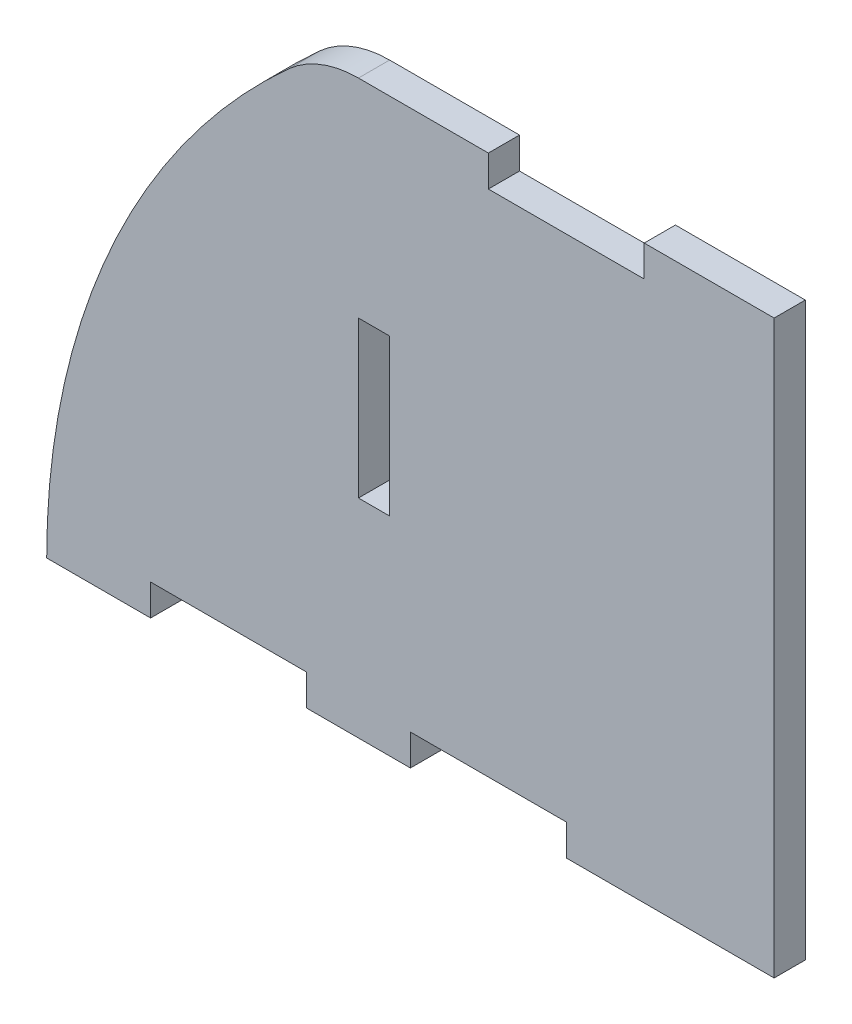
ISO-10303-21;
HEADER;
FILE_DESCRIPTION(('STEP AP214'),'2;1');
FILE_NAME('part.step','',(''),(''),'','','');
FILE_SCHEMA(('AUTOMOTIVE_DESIGN { 1 0 10303 214 1 1 1 1 }'));
ENDSEC;
DATA;
#1=APPLICATION_CONTEXT('core data for automotive mechanical design processes');
#2=APPLICATION_PROTOCOL_DEFINITION('international standard','automotive_design',2000,#1);
#3=PRODUCT_CONTEXT('',#1,'mechanical');
#4=PRODUCT('Part','Part','',(#3));
#5=PRODUCT_RELATED_PRODUCT_CATEGORY('part','',(#4));
#6=PRODUCT_DEFINITION_FORMATION('','',#4);
#7=PRODUCT_DEFINITION_CONTEXT('part definition',#1,'design');
#8=PRODUCT_DEFINITION('design','',#6,#7);
#9=PRODUCT_DEFINITION_SHAPE('','',#8);
#10=(LENGTH_UNIT() NAMED_UNIT(*) SI_UNIT(.MILLI.,.METRE.));
#11=(NAMED_UNIT(*) PLANE_ANGLE_UNIT() SI_UNIT($,.RADIAN.));
#12=(NAMED_UNIT(*) SI_UNIT($,.STERADIAN.) SOLID_ANGLE_UNIT());
#13=UNCERTAINTY_MEASURE_WITH_UNIT(LENGTH_MEASURE(1.E-05),#10,'distance_accuracy_value','');
#14=(GEOMETRIC_REPRESENTATION_CONTEXT(3) GLOBAL_UNCERTAINTY_ASSIGNED_CONTEXT((#13)) GLOBAL_UNIT_ASSIGNED_CONTEXT((#10,
#11,#12)) REPRESENTATION_CONTEXT('',''));
#15=CARTESIAN_POINT('',(0.,0.,0.));
#16=DIRECTION('',(0.,0.,1.));
#17=DIRECTION('',(1.,0.,0.));
#18=AXIS2_PLACEMENT_3D('',#15,#16,#17);
#19=CARTESIAN_POINT('',(-70.0000000000001,0.,3.00000000000034));
#20=DIRECTION('',(0.,1.,0.));
#21=DIRECTION('',(0.,0.,1.00000000000001));
#22=AXIS2_PLACEMENT_3D('',#19,#20,#21);
#23=PLANE('',#22);
#24=DIRECTION('',(1.00000000000001,0.,0.));
#25=VECTOR('',#24,1.);
#26=CARTESIAN_POINT('',(-70.0000000000001,0.,3.33066907387547E-13));
#27=LINE('',#26,#25);
#28=CARTESIAN_POINT('',(-70.0000000000001,0.,3.33066907387547E-13));
#29=VERTEX_POINT('',#28);
#30=CARTESIAN_POINT('',(-60.0000000000001,0.,2.77555756156289E-13));
#31=VERTEX_POINT('',#30);
#32=EDGE_CURVE('E307',#29,#31,#27,.T.);
#33=ORIENTED_EDGE('',*,*,#32,.T.);
#34=DIRECTION('',(0.,0.,1.00000000000001));
#35=VECTOR('',#34,1.);
#36=CARTESIAN_POINT('',(-60.0000000000001,0.,2.77555756156289E-13));
#37=LINE('',#36,#35);
#38=CARTESIAN_POINT('',(-60.0000000000001,0.,3.00000000000028));
#39=VERTEX_POINT('',#38);
#40=EDGE_CURVE('E222',#31,#39,#37,.T.);
#41=ORIENTED_EDGE('',*,*,#40,.T.);
#42=DIRECTION('',(1.00000000000001,0.,0.));
#43=VECTOR('',#42,1.);
#44=CARTESIAN_POINT('',(-70.0000000000001,0.,3.00000000000034));
#45=LINE('',#44,#43);
#46=CARTESIAN_POINT('',(-70.0000000000001,0.,3.00000000000034));
#47=VERTEX_POINT('',#46);
#48=EDGE_CURVE('E291',#47,#39,#45,.T.);
#49=ORIENTED_EDGE('',*,*,#48,.F.);
#50=DIRECTION('',(0.,0.,-1.00000000000001));
#51=VECTOR('',#50,1.);
#52=CARTESIAN_POINT('',(-70.0000000000001,0.,3.00000000000034));
#53=LINE('',#52,#51);
#54=EDGE_CURVE('E306',#47,#29,#53,.T.);
#55=ORIENTED_EDGE('',*,*,#54,.T.);
#56=EDGE_LOOP('',(#33,#41,#49,#55));
#57=FACE_BOUND('',#56,.T.);
#58=ADVANCED_FACE('F32',(#57),#23,.F.);
#59=CARTESIAN_POINT('',(-44.9999999999999,0.,3.00000000000022));
#60=VERTEX_POINT('',#59);
#61=CARTESIAN_POINT('',(-34.9999999999999,0.,3.00000000000022));
#62=VERTEX_POINT('',#61);
#63=EDGE_CURVE('E295',#60,#62,#45,.T.);
#64=ORIENTED_EDGE('',*,*,#63,.F.);
#65=DIRECTION('',(0.,0.,1.00000000000001));
#66=VECTOR('',#65,1.);
#67=CARTESIAN_POINT('',(-44.9999999999999,0.,0.));
#68=LINE('',#67,#66);
#69=CARTESIAN_POINT('',(-44.9999999999999,0.,0.));
#70=VERTEX_POINT('',#69);
#71=EDGE_CURVE('E234',#70,#60,#68,.T.);
#72=ORIENTED_EDGE('',*,*,#71,.F.);
#73=CARTESIAN_POINT('',(-35.0000000000001,0.,0.));
#74=VERTEX_POINT('',#73);
#75=EDGE_CURVE('E311',#70,#74,#27,.T.);
#76=ORIENTED_EDGE('',*,*,#75,.T.);
#77=DIRECTION('',(0.,0.,1.00000000000001));
#78=VECTOR('',#77,1.);
#79=CARTESIAN_POINT('',(-35.0000000000001,0.,0.));
#80=LINE('',#79,#78);
#81=EDGE_CURVE('E248',#74,#62,#80,.T.);
#82=ORIENTED_EDGE('',*,*,#81,.T.);
#83=EDGE_LOOP('',(#64,#72,#76,#82));
#84=FACE_BOUND('',#83,.T.);
#85=ADVANCED_FACE('F361',(#84),#23,.F.);
#86=CARTESIAN_POINT('',(0.,55.,3.));
#87=DIRECTION('',(0.,-1.,0.));
#88=DIRECTION('',(0.,0.,-1.00000000000001));
#89=AXIS2_PLACEMENT_3D('',#86,#87,#88);
#90=PLANE('',#89);
#91=DIRECTION('',(-1.00000000000001,0.,0.));
#92=VECTOR('',#91,1.);
#93=CARTESIAN_POINT('',(0.,55.,3.));
#94=LINE('',#93,#92);
#95=CARTESIAN_POINT('',(-27.5000000000001,55.,3.00000000000028));
#96=VERTEX_POINT('',#95);
#97=CARTESIAN_POINT('',(-40.,55.,3.00000000000028));
#98=VERTEX_POINT('',#97);
#99=EDGE_CURVE('E298',#96,#98,#94,.T.);
#100=ORIENTED_EDGE('',*,*,#99,.F.);
#101=DIRECTION('',(0.,0.,1.00000000000001));
#102=VECTOR('',#101,1.);
#103=CARTESIAN_POINT('',(-27.5000000000001,55.,2.77555756156289E-13));
#104=LINE('',#103,#102);
#105=CARTESIAN_POINT('',(-27.5000000000001,55.,2.77555756156289E-13));
#106=VERTEX_POINT('',#105);
#107=EDGE_CURVE('E282',#106,#96,#104,.T.);
#108=ORIENTED_EDGE('',*,*,#107,.F.);
#109=DIRECTION('',(-1.00000000000001,0.,0.));
#110=VECTOR('',#109,1.);
#111=CARTESIAN_POINT('',(0.,55.,0.));
#112=LINE('',#111,#110);
#113=CARTESIAN_POINT('',(-40.,55.,2.77555756156289E-13));
#114=VERTEX_POINT('',#113);
#115=EDGE_CURVE('E313',#106,#114,#112,.T.);
#116=ORIENTED_EDGE('',*,*,#115,.T.);
#117=DIRECTION('',(0.,0.,-1.00000000000001));
#118=VECTOR('',#117,1.);
#119=CARTESIAN_POINT('',(-40.,55.,3.00000000000028));
#120=LINE('',#119,#118);
#121=EDGE_CURVE('E326',#98,#114,#120,.T.);
#122=ORIENTED_EDGE('',*,*,#121,.F.);
#123=EDGE_LOOP('',(#100,#108,#116,#122));
#124=FACE_BOUND('',#123,.T.);
#125=ADVANCED_FACE('F399',(#124),#90,.F.);
#126=CARTESIAN_POINT('',(-20.,0.,3.00000000000028));
#127=VERTEX_POINT('',#126);
#128=CARTESIAN_POINT('',(0.,0.,3.));
#129=VERTEX_POINT('',#128);
#130=EDGE_CURVE('E296',#127,#129,#45,.T.);
#131=ORIENTED_EDGE('',*,*,#130,.F.);
#132=DIRECTION('',(0.,0.,1.00000000000001));
#133=VECTOR('',#132,1.);
#134=CARTESIAN_POINT('',(-20.,0.,2.77555756156289E-13));
#135=LINE('',#134,#133);
#136=CARTESIAN_POINT('',(-20.,0.,2.77555756156289E-13));
#137=VERTEX_POINT('',#136);
#138=EDGE_CURVE('E261',#137,#127,#135,.T.);
#139=ORIENTED_EDGE('',*,*,#138,.F.);
#140=CARTESIAN_POINT('',(0.,0.,0.));
#141=VERTEX_POINT('',#140);
#142=EDGE_CURVE('E284',#137,#141,#27,.T.);
#143=ORIENTED_EDGE('',*,*,#142,.T.);
#144=DIRECTION('',(0.,0.,-1.00000000000001));
#145=VECTOR('',#144,1.);
#146=CARTESIAN_POINT('',(0.,0.,3.));
#147=LINE('',#146,#145);
#148=EDGE_CURVE('E11',#129,#141,#147,.T.);
#149=ORIENTED_EDGE('',*,*,#148,.F.);
#150=EDGE_LOOP('',(#131,#139,#143,#149));
#151=FACE_BOUND('',#150,.T.);
#152=ADVANCED_FACE('F34',(#151),#23,.F.);
#153=CARTESIAN_POINT('',(0.,0.,3.));
#154=DIRECTION('',(-1.00000000000001,0.,0.));
#155=DIRECTION('',(0.,0.,1.00000000000001));
#156=AXIS2_PLACEMENT_3D('',#153,#154,#155);
#157=PLANE('',#156);
#158=DIRECTION('',(0.,1.,0.));
#159=VECTOR('',#158,1.);
#160=CARTESIAN_POINT('',(0.,0.,0.));
#161=LINE('',#160,#159);
#162=CARTESIAN_POINT('',(0.,55.,0.));
#163=VERTEX_POINT('',#162);
#164=EDGE_CURVE('E310',#141,#163,#161,.T.);
#165=ORIENTED_EDGE('',*,*,#164,.T.);
#166=DIRECTION('',(0.,0.,-1.00000000000001));
#167=VECTOR('',#166,1.);
#168=CARTESIAN_POINT('',(0.,55.,3.));
#169=LINE('',#168,#167);
#170=CARTESIAN_POINT('',(0.,55.,3.));
#171=VERTEX_POINT('',#170);
#172=EDGE_CURVE('E40',#171,#163,#169,.T.);
#173=ORIENTED_EDGE('',*,*,#172,.F.);
#174=DIRECTION('',(0.,1.,0.));
#175=VECTOR('',#174,1.);
#176=CARTESIAN_POINT('',(0.,0.,3.));
#177=LINE('',#176,#175);
#178=EDGE_CURVE('E294',#129,#171,#177,.T.);
#179=ORIENTED_EDGE('',*,*,#178,.F.);
#180=ORIENTED_EDGE('',*,*,#148,.T.);
#181=EDGE_LOOP('',(#165,#173,#179,#180));
#182=FACE_BOUND('',#181,.T.);
#183=ADVANCED_FACE('F353',(#182),#157,.F.);
#184=CARTESIAN_POINT('',(-12.5,55.,0.));
#185=VERTEX_POINT('',#184);
#186=EDGE_CURVE('E314',#163,#185,#112,.T.);
#187=ORIENTED_EDGE('',*,*,#186,.T.);
#188=DIRECTION('',(0.,0.,1.00000000000001));
#189=VECTOR('',#188,1.);
#190=CARTESIAN_POINT('',(-12.5,55.,0.));
#191=LINE('',#190,#189);
#192=CARTESIAN_POINT('',(-12.5000000000002,55.,3.));
#193=VERTEX_POINT('',#192);
#194=EDGE_CURVE('E285',#185,#193,#191,.T.);
#195=ORIENTED_EDGE('',*,*,#194,.T.);
#196=EDGE_CURVE('E299',#171,#193,#94,.T.);
#197=ORIENTED_EDGE('',*,*,#196,.F.);
#198=ORIENTED_EDGE('',*,*,#172,.T.);
#199=EDGE_LOOP('',(#187,#195,#197,#198));
#200=FACE_BOUND('',#199,.T.);
#201=ADVANCED_FACE('F333',(#200),#90,.F.);
#202=CARTESIAN_POINT('',(-40.,45.,3.00000000000028));
#203=DIRECTION('',(0.,0.,-1.00000000000001));
#204=DIRECTION('',(-1.00000000000001,0.,0.));
#205=AXIS2_PLACEMENT_3D('',#202,#203,#204);
#206=CYLINDRICAL_SURFACE('',#205,9.99999999999994);
#207=CARTESIAN_POINT('',(-40.,45.,2.77555756156289E-13));
#208=DIRECTION('',(0.,0.,1.00000000000001));
#209=DIRECTION('',(1.00000000000001,0.,0.));
#210=AXIS2_PLACEMENT_3D('',#207,#208,#209);
#211=CIRCLE('',#210,9.99999999999994);
#212=CARTESIAN_POINT('',(-46.7010309278351,52.4226804123711,2.77555756156289E-13));
#213=VERTEX_POINT('',#212);
#214=EDGE_CURVE('E317',#114,#213,#211,.T.);
#215=ORIENTED_EDGE('',*,*,#214,.T.);
#216=DIRECTION('',(0.,0.,-1.00000000000001));
#217=VECTOR('',#216,1.);
#218=CARTESIAN_POINT('',(-46.7010309278351,52.4226804123711,3.00000000000028));
#219=LINE('',#218,#217);
#220=CARTESIAN_POINT('',(-46.7010309278351,52.4226804123711,3.00000000000028));
#221=VERTEX_POINT('',#220);
#222=EDGE_CURVE('E323',#221,#213,#219,.T.);
#223=ORIENTED_EDGE('',*,*,#222,.F.);
#224=CARTESIAN_POINT('',(-40.,45.,3.00000000000028));
#225=DIRECTION('',(0.,0.,1.00000000000001));
#226=DIRECTION('',(1.00000000000001,0.,0.));
#227=AXIS2_PLACEMENT_3D('',#224,#225,#226);
#228=CIRCLE('',#227,9.99999999999994);
#229=EDGE_CURVE('E302',#98,#221,#228,.T.);
#230=ORIENTED_EDGE('',*,*,#229,.F.);
#231=ORIENTED_EDGE('',*,*,#121,.T.);
#232=EDGE_LOOP('',(#215,#223,#230,#231));
#233=FACE_BOUND('',#232,.T.);
#234=ADVANCED_FACE('F395',(#233),#206,.T.);
#235=CARTESIAN_POINT('',(0.624999999999654,0.,3.));
#236=DIRECTION('',(0.,0.,-1.00000000000001));
#237=DIRECTION('',(-1.00000000000001,0.,0.));
#238=AXIS2_PLACEMENT_3D('',#235,#236,#237);
#239=CYLINDRICAL_SURFACE('',#238,70.6249999999997);
#240=CARTESIAN_POINT('',(0.624999999999876,0.,0.));
#241=DIRECTION('',(0.,0.,1.00000000000001));
#242=DIRECTION('',(1.00000000000001,0.,0.));
#243=AXIS2_PLACEMENT_3D('',#240,#241,#242);
#244=CIRCLE('',#243,70.6249999999997);
#245=EDGE_CURVE('E319',#213,#29,#244,.T.);
#246=ORIENTED_EDGE('',*,*,#245,.T.);
#247=ORIENTED_EDGE('',*,*,#54,.F.);
#248=CARTESIAN_POINT('',(0.624999999999654,0.,3.));
#249=DIRECTION('',(0.,0.,1.00000000000001));
#250=DIRECTION('',(1.00000000000001,0.,0.));
#251=AXIS2_PLACEMENT_3D('',#248,#249,#250);
#252=CIRCLE('',#251,70.6249999999997);
#253=EDGE_CURVE('E304',#221,#47,#252,.T.);
#254=ORIENTED_EDGE('',*,*,#253,.F.);
#255=ORIENTED_EDGE('',*,*,#222,.T.);
#256=EDGE_LOOP('',(#246,#247,#254,#255));
#257=FACE_BOUND('',#256,.T.);
#258=ADVANCED_FACE('F390',(#257),#239,.T.);
#259=CARTESIAN_POINT('',(-40.,45.,3.00000000000028));
#260=DIRECTION('',(0.,0.,1.00000000000001));
#261=DIRECTION('',(1.00000000000001,0.,0.));
#262=AXIS2_PLACEMENT_3D('',#259,#260,#261);
#263=PLANE('',#262);
#264=DIRECTION('',(0.,-1.,0.));
#265=VECTOR('',#264,1.);
#266=CARTESIAN_POINT('',(-40.,35.,3.00000000000028));
#267=LINE('',#266,#265);
#268=CARTESIAN_POINT('',(-40.,35.,3.00000000000028));
#269=VERTEX_POINT('',#268);
#270=CARTESIAN_POINT('',(-40.,20.,3.00000000000028));
#271=VERTEX_POINT('',#270);
#272=EDGE_CURVE('E47',#269,#271,#267,.T.);
#273=ORIENTED_EDGE('',*,*,#272,.F.);
#274=DIRECTION('',(-1.00000000000001,0.,0.));
#275=VECTOR('',#274,1.);
#276=CARTESIAN_POINT('',(-40.,35.,3.00000000000028));
#277=LINE('',#276,#275);
#278=CARTESIAN_POINT('',(-36.9999999999999,35.,3.00000000000028));
#279=VERTEX_POINT('',#278);
#280=EDGE_CURVE('E193',#279,#269,#277,.T.);
#281=ORIENTED_EDGE('',*,*,#280,.F.);
#282=DIRECTION('',(0.,1.,0.));
#283=VECTOR('',#282,1.);
#284=CARTESIAN_POINT('',(-36.9999999999999,35.,3.00000000000028));
#285=LINE('',#284,#283);
#286=CARTESIAN_POINT('',(-36.9999999999999,20.,3.00000000000028));
#287=VERTEX_POINT('',#286);
#288=EDGE_CURVE('E196',#287,#279,#285,.T.);
#289=ORIENTED_EDGE('',*,*,#288,.F.);
#290=DIRECTION('',(1.00000000000001,0.,0.));
#291=VECTOR('',#290,1.);
#292=CARTESIAN_POINT('',(-40.,20.,3.00000000000028));
#293=LINE('',#292,#291);
#294=EDGE_CURVE('E202',#271,#287,#293,.T.);
#295=ORIENTED_EDGE('',*,*,#294,.F.);
#296=EDGE_LOOP('',(#273,#281,#289,#295));
#297=FACE_BOUND('',#296,.T.);
#298=DIRECTION('',(0.,-1.,0.));
#299=VECTOR('',#298,1.);
#300=CARTESIAN_POINT('',(-60.0000000000001,0.,3.00000000000028));
#301=LINE('',#300,#299);
#302=CARTESIAN_POINT('',(-60.0000000000001,3.00000000000001,3.00000000000028));
#303=VERTEX_POINT('',#302);
#304=EDGE_CURVE('E208',#303,#39,#301,.T.);
#305=ORIENTED_EDGE('',*,*,#304,.F.);
#306=DIRECTION('',(-1.00000000000001,0.,0.));
#307=VECTOR('',#306,1.);
#308=CARTESIAN_POINT('',(-60.0000000000001,3.00000000000001,3.00000000000028));
#309=LINE('',#308,#307);
#310=CARTESIAN_POINT('',(-44.9999999999999,3.00000000000001,3.00000000000022));
#311=VERTEX_POINT('',#310);
#312=EDGE_CURVE('E216',#311,#303,#309,.T.);
#313=ORIENTED_EDGE('',*,*,#312,.F.);
#314=DIRECTION('',(0.,1.,0.));
#315=VECTOR('',#314,1.);
#316=CARTESIAN_POINT('',(-44.9999999999999,0.,3.00000000000022));
#317=LINE('',#316,#315);
#318=EDGE_CURVE('E224',#60,#311,#317,.T.);
#319=ORIENTED_EDGE('',*,*,#318,.F.);
#320=ORIENTED_EDGE('',*,*,#63,.T.);
#321=DIRECTION('',(0.,-1.,0.));
#322=VECTOR('',#321,1.);
#323=CARTESIAN_POINT('',(-34.9999999999999,0.,3.00000000000022));
#324=LINE('',#323,#322);
#325=CARTESIAN_POINT('',(-34.9999999999999,3.00000000000001,3.00000000000022));
#326=VERTEX_POINT('',#325);
#327=EDGE_CURVE('E231',#326,#62,#324,.T.);
#328=ORIENTED_EDGE('',*,*,#327,.F.);
#329=DIRECTION('',(-1.00000000000001,0.,0.));
#330=VECTOR('',#329,1.);
#331=CARTESIAN_POINT('',(-34.9999999999999,3.00000000000001,3.00000000000022));
#332=LINE('',#331,#330);
#333=CARTESIAN_POINT('',(-20.,3.00000000000001,3.00000000000028));
#334=VERTEX_POINT('',#333);
#335=EDGE_CURVE('E242',#334,#326,#332,.T.);
#336=ORIENTED_EDGE('',*,*,#335,.F.);
#337=DIRECTION('',(0.,1.,0.));
#338=VECTOR('',#337,1.);
#339=CARTESIAN_POINT('',(-20.,0.,3.00000000000028));
#340=LINE('',#339,#338);
#341=EDGE_CURVE('E251',#127,#334,#340,.T.);
#342=ORIENTED_EDGE('',*,*,#341,.F.);
#343=ORIENTED_EDGE('',*,*,#130,.T.);
#344=ORIENTED_EDGE('',*,*,#178,.T.);
#345=ORIENTED_EDGE('',*,*,#196,.T.);
#346=DIRECTION('',(0.,1.,0.));
#347=VECTOR('',#346,1.);
#348=CARTESIAN_POINT('',(-12.5000000000002,55.,3.));
#349=LINE('',#348,#347);
#350=CARTESIAN_POINT('',(-12.5000000000002,52.,3.));
#351=VERTEX_POINT('',#350);
#352=EDGE_CURVE('E269',#351,#193,#349,.T.);
#353=ORIENTED_EDGE('',*,*,#352,.F.);
#354=DIRECTION('',(1.00000000000001,0.,0.));
#355=VECTOR('',#354,1.);
#356=CARTESIAN_POINT('',(-27.5000000000001,52.,3.00000000000028));
#357=LINE('',#356,#355);
#358=CARTESIAN_POINT('',(-27.5000000000001,52.,3.00000000000028));
#359=VERTEX_POINT('',#358);
#360=EDGE_CURVE('E278',#359,#351,#357,.T.);
#361=ORIENTED_EDGE('',*,*,#360,.F.);
#362=DIRECTION('',(0.,-1.,0.));
#363=VECTOR('',#362,1.);
#364=CARTESIAN_POINT('',(-27.5000000000001,55.,3.00000000000028));
#365=LINE('',#364,#363);
#366=EDGE_CURVE('E258',#96,#359,#365,.T.);
#367=ORIENTED_EDGE('',*,*,#366,.F.);
#368=ORIENTED_EDGE('',*,*,#99,.T.);
#369=ORIENTED_EDGE('',*,*,#229,.T.);
#370=ORIENTED_EDGE('',*,*,#253,.T.);
#371=ORIENTED_EDGE('',*,*,#48,.T.);
#372=EDGE_LOOP('',(#305,#313,#319,#320,#328,#336,#342,#343,#344,#345,#353,#361,#367,#368,#369,
#370,#371));
#373=FACE_BOUND('',#372,.T.);
#374=ADVANCED_FACE('F349',(#297,#373),#263,.T.);
#375=CARTESIAN_POINT('',(-40.,45.,2.77555756156289E-13));
#376=DIRECTION('',(0.,0.,1.00000000000001));
#377=DIRECTION('',(1.00000000000001,0.,0.));
#378=AXIS2_PLACEMENT_3D('',#375,#376,#377);
#379=PLANE('',#378);
#380=DIRECTION('',(-1.00000000000001,0.,0.));
#381=VECTOR('',#380,1.);
#382=CARTESIAN_POINT('',(-40.,35.,2.77555756156289E-13));
#383=LINE('',#382,#381);
#384=CARTESIAN_POINT('',(-37.0000000000001,35.,2.77555756156289E-13));
#385=VERTEX_POINT('',#384);
#386=CARTESIAN_POINT('',(-40.,35.,2.77555756156289E-13));
#387=VERTEX_POINT('',#386);
#388=EDGE_CURVE('E183',#385,#387,#383,.T.);
#389=ORIENTED_EDGE('',*,*,#388,.T.);
#390=DIRECTION('',(0.,-1.,0.));
#391=VECTOR('',#390,1.);
#392=CARTESIAN_POINT('',(-40.,35.,2.77555756156289E-13));
#393=LINE('',#392,#391);
#394=CARTESIAN_POINT('',(-40.,20.,2.77555756156289E-13));
#395=VERTEX_POINT('',#394);
#396=EDGE_CURVE('E177',#387,#395,#393,.T.);
#397=ORIENTED_EDGE('',*,*,#396,.T.);
#398=DIRECTION('',(1.00000000000001,0.,0.));
#399=VECTOR('',#398,1.);
#400=CARTESIAN_POINT('',(-40.,20.,2.77555756156289E-13));
#401=LINE('',#400,#399);
#402=CARTESIAN_POINT('',(-37.0000000000001,20.,2.77555756156289E-13));
#403=VERTEX_POINT('',#402);
#404=EDGE_CURVE('E186',#395,#403,#401,.T.);
#405=ORIENTED_EDGE('',*,*,#404,.T.);
#406=DIRECTION('',(0.,1.,0.));
#407=VECTOR('',#406,1.);
#408=CARTESIAN_POINT('',(-37.0000000000001,35.,2.77555756156289E-13));
#409=LINE('',#408,#407);
#410=EDGE_CURVE('E55',#403,#385,#409,.T.);
#411=ORIENTED_EDGE('',*,*,#410,.T.);
#412=EDGE_LOOP('',(#389,#397,#405,#411));
#413=FACE_BOUND('',#412,.T.);
#414=DIRECTION('',(-1.00000000000001,0.,0.));
#415=VECTOR('',#414,1.);
#416=CARTESIAN_POINT('',(-60.0000000000001,3.00000000000001,2.77555756156289E-13));
#417=LINE('',#416,#415);
#418=CARTESIAN_POINT('',(-44.9999999999999,3.00000000000001,0.));
#419=VERTEX_POINT('',#418);
#420=CARTESIAN_POINT('',(-60.0000000000001,3.00000000000001,2.77555756156289E-13));
#421=VERTEX_POINT('',#420);
#422=EDGE_CURVE('E219',#419,#421,#417,.T.);
#423=ORIENTED_EDGE('',*,*,#422,.T.);
#424=DIRECTION('',(0.,-1.,0.));
#425=VECTOR('',#424,1.);
#426=CARTESIAN_POINT('',(-60.0000000000001,0.,2.77555756156289E-13));
#427=LINE('',#426,#425);
#428=EDGE_CURVE('E212',#421,#31,#427,.T.);
#429=ORIENTED_EDGE('',*,*,#428,.T.);
#430=ORIENTED_EDGE('',*,*,#32,.F.);
#431=ORIENTED_EDGE('',*,*,#245,.F.);
#432=ORIENTED_EDGE('',*,*,#214,.F.);
#433=ORIENTED_EDGE('',*,*,#115,.F.);
#434=DIRECTION('',(0.,-1.,0.));
#435=VECTOR('',#434,1.);
#436=CARTESIAN_POINT('',(-27.5000000000001,55.,2.77555756156289E-13));
#437=LINE('',#436,#435);
#438=CARTESIAN_POINT('',(-27.5000000000001,52.,2.77555756156289E-13));
#439=VERTEX_POINT('',#438);
#440=EDGE_CURVE('E265',#106,#439,#437,.T.);
#441=ORIENTED_EDGE('',*,*,#440,.T.);
#442=DIRECTION('',(1.00000000000001,0.,0.));
#443=VECTOR('',#442,1.);
#444=CARTESIAN_POINT('',(-27.5000000000001,52.,2.77555756156289E-13));
#445=LINE('',#444,#443);
#446=CARTESIAN_POINT('',(-12.5,52.,0.));
#447=VERTEX_POINT('',#446);
#448=EDGE_CURVE('E268',#439,#447,#445,.T.);
#449=ORIENTED_EDGE('',*,*,#448,.T.);
#450=DIRECTION('',(0.,1.,0.));
#451=VECTOR('',#450,1.);
#452=CARTESIAN_POINT('',(-12.5,55.,0.));
#453=LINE('',#452,#451);
#454=EDGE_CURVE('E272',#447,#185,#453,.T.);
#455=ORIENTED_EDGE('',*,*,#454,.T.);
#456=ORIENTED_EDGE('',*,*,#186,.F.);
#457=ORIENTED_EDGE('',*,*,#164,.F.);
#458=ORIENTED_EDGE('',*,*,#142,.F.);
#459=DIRECTION('',(0.,1.,0.));
#460=VECTOR('',#459,1.);
#461=CARTESIAN_POINT('',(-20.,0.,2.77555756156289E-13));
#462=LINE('',#461,#460);
#463=CARTESIAN_POINT('',(-20.,3.00000000000001,2.77555756156289E-13));
#464=VERTEX_POINT('',#463);
#465=EDGE_CURVE('E241',#137,#464,#462,.T.);
#466=ORIENTED_EDGE('',*,*,#465,.T.);
#467=DIRECTION('',(-1.00000000000001,0.,0.));
#468=VECTOR('',#467,1.);
#469=CARTESIAN_POINT('',(-35.0000000000001,3.00000000000001,0.));
#470=LINE('',#469,#468);
#471=CARTESIAN_POINT('',(-35.0000000000001,3.00000000000001,0.));
#472=VERTEX_POINT('',#471);
#473=EDGE_CURVE('E245',#464,#472,#470,.T.);
#474=ORIENTED_EDGE('',*,*,#473,.T.);
#475=DIRECTION('',(0.,-1.,0.));
#476=VECTOR('',#475,1.);
#477=CARTESIAN_POINT('',(-35.0000000000001,0.,0.));
#478=LINE('',#477,#476);
#479=EDGE_CURVE('E238',#472,#74,#478,.T.);
#480=ORIENTED_EDGE('',*,*,#479,.T.);
#481=ORIENTED_EDGE('',*,*,#75,.F.);
#482=DIRECTION('',(0.,1.,0.));
#483=VECTOR('',#482,1.);
#484=CARTESIAN_POINT('',(-44.9999999999999,0.,0.));
#485=LINE('',#484,#483);
#486=EDGE_CURVE('E215',#70,#419,#485,.T.);
#487=ORIENTED_EDGE('',*,*,#486,.T.);
#488=EDGE_LOOP('',(#423,#429,#430,#431,#432,#433,#441,#449,#455,#456,#457,#458,#466,#474,#480,
#481,#487));
#489=FACE_BOUND('',#488,.T.);
#490=ADVANCED_FACE('F190',(#413,#489),#379,.F.);
#491=CARTESIAN_POINT('',(-27.5000000000001,55.,2.77555756156289E-13));
#492=DIRECTION('',(-1.00000000000001,0.,0.));
#493=DIRECTION('',(0.,-1.,0.));
#494=AXIS2_PLACEMENT_3D('',#491,#492,#493);
#495=PLANE('',#494);
#496=ORIENTED_EDGE('',*,*,#366,.T.);
#497=DIRECTION('',(0.,0.,1.00000000000001));
#498=VECTOR('',#497,1.);
#499=CARTESIAN_POINT('',(-27.5000000000001,52.,2.77555756156289E-13));
#500=LINE('',#499,#498);
#501=EDGE_CURVE('E275',#439,#359,#500,.T.);
#502=ORIENTED_EDGE('',*,*,#501,.F.);
#503=ORIENTED_EDGE('',*,*,#440,.F.);
#504=ORIENTED_EDGE('',*,*,#107,.T.);
#505=EDGE_LOOP('',(#496,#502,#503,#504));
#506=FACE_BOUND('',#505,.T.);
#507=ADVANCED_FACE('F402',(#506),#495,.F.);
#508=CARTESIAN_POINT('',(-12.5,55.,0.));
#509=DIRECTION('',(1.00000000000001,0.,0.));
#510=DIRECTION('',(0.,0.,-1.00000000000001));
#511=AXIS2_PLACEMENT_3D('',#508,#509,#510);
#512=PLANE('',#511);
#513=ORIENTED_EDGE('',*,*,#352,.T.);
#514=ORIENTED_EDGE('',*,*,#194,.F.);
#515=ORIENTED_EDGE('',*,*,#454,.F.);
#516=DIRECTION('',(0.,0.,1.00000000000001));
#517=VECTOR('',#516,1.);
#518=CARTESIAN_POINT('',(-12.5,52.,0.));
#519=LINE('',#518,#517);
#520=EDGE_CURVE('E288',#447,#351,#519,.T.);
#521=ORIENTED_EDGE('',*,*,#520,.T.);
#522=EDGE_LOOP('',(#513,#514,#515,#521));
#523=FACE_BOUND('',#522,.T.);
#524=ADVANCED_FACE('F341',(#523),#512,.F.);
#525=CARTESIAN_POINT('',(-27.5000000000001,52.,2.77555756156289E-13));
#526=DIRECTION('',(0.,-1.,0.));
#527=DIRECTION('',(0.,0.,-1.00000000000001));
#528=AXIS2_PLACEMENT_3D('',#525,#526,#527);
#529=PLANE('',#528);
#530=ORIENTED_EDGE('',*,*,#360,.T.);
#531=ORIENTED_EDGE('',*,*,#520,.F.);
#532=ORIENTED_EDGE('',*,*,#448,.F.);
#533=ORIENTED_EDGE('',*,*,#501,.T.);
#534=EDGE_LOOP('',(#530,#531,#532,#533));
#535=FACE_BOUND('',#534,.T.);
#536=ADVANCED_FACE('F343',(#535),#529,.F.);
#537=CARTESIAN_POINT('',(-35.0000000000001,0.,0.));
#538=DIRECTION('',(-1.00000000000001,0.,0.));
#539=DIRECTION('',(0.,0.,1.00000000000001));
#540=AXIS2_PLACEMENT_3D('',#537,#538,#539);
#541=PLANE('',#540);
#542=ORIENTED_EDGE('',*,*,#327,.T.);
#543=ORIENTED_EDGE('',*,*,#81,.F.);
#544=ORIENTED_EDGE('',*,*,#479,.F.);
#545=DIRECTION('',(0.,0.,1.00000000000001));
#546=VECTOR('',#545,1.);
#547=CARTESIAN_POINT('',(-35.0000000000001,3.00000000000001,0.));
#548=LINE('',#547,#546);
#549=EDGE_CURVE('E256',#472,#326,#548,.T.);
#550=ORIENTED_EDGE('',*,*,#549,.T.);
#551=EDGE_LOOP('',(#542,#543,#544,#550));
#552=FACE_BOUND('',#551,.T.);
#553=ADVANCED_FACE('F364',(#552),#541,.F.);
#554=CARTESIAN_POINT('',(-35.0000000000001,3.00000000000001,0.));
#555=DIRECTION('',(0.,1.,0.));
#556=DIRECTION('',(0.,0.,1.00000000000001));
#557=AXIS2_PLACEMENT_3D('',#554,#555,#556);
#558=PLANE('',#557);
#559=ORIENTED_EDGE('',*,*,#335,.T.);
#560=ORIENTED_EDGE('',*,*,#549,.F.);
#561=ORIENTED_EDGE('',*,*,#473,.F.);
#562=DIRECTION('',(0.,0.,1.00000000000001));
#563=VECTOR('',#562,1.);
#564=CARTESIAN_POINT('',(-20.,3.00000000000001,2.77555756156289E-13));
#565=LINE('',#564,#563);
#566=EDGE_CURVE('E259',#464,#334,#565,.T.);
#567=ORIENTED_EDGE('',*,*,#566,.T.);
#568=EDGE_LOOP('',(#559,#560,#561,#567));
#569=FACE_BOUND('',#568,.T.);
#570=ADVANCED_FACE('F368',(#569),#558,.F.);
#571=CARTESIAN_POINT('',(-20.,0.,2.77555756156289E-13));
#572=DIRECTION('',(1.00000000000001,0.,0.));
#573=DIRECTION('',(0.,1.,0.));
#574=AXIS2_PLACEMENT_3D('',#571,#572,#573);
#575=PLANE('',#574);
#576=ORIENTED_EDGE('',*,*,#341,.T.);
#577=ORIENTED_EDGE('',*,*,#566,.F.);
#578=ORIENTED_EDGE('',*,*,#465,.F.);
#579=ORIENTED_EDGE('',*,*,#138,.T.);
#580=EDGE_LOOP('',(#576,#577,#578,#579));
#581=FACE_BOUND('',#580,.T.);
#582=ADVANCED_FACE('F370',(#581),#575,.F.);
#583=CARTESIAN_POINT('',(-60.0000000000001,0.,2.77555756156289E-13));
#584=DIRECTION('',(-1.00000000000001,0.,0.));
#585=DIRECTION('',(0.,0.,1.00000000000001));
#586=AXIS2_PLACEMENT_3D('',#583,#584,#585);
#587=PLANE('',#586);
#588=ORIENTED_EDGE('',*,*,#304,.T.);
#589=ORIENTED_EDGE('',*,*,#40,.F.);
#590=ORIENTED_EDGE('',*,*,#428,.F.);
#591=DIRECTION('',(0.,0.,1.00000000000001));
#592=VECTOR('',#591,1.);
#593=CARTESIAN_POINT('',(-60.0000000000001,3.00000000000001,2.77555756156289E-13));
#594=LINE('',#593,#592);
#595=EDGE_CURVE('E229',#421,#303,#594,.T.);
#596=ORIENTED_EDGE('',*,*,#595,.T.);
#597=EDGE_LOOP('',(#588,#589,#590,#596));
#598=FACE_BOUND('',#597,.T.);
#599=ADVANCED_FACE('F382',(#598),#587,.F.);
#600=CARTESIAN_POINT('',(-60.0000000000001,3.00000000000001,2.77555756156289E-13));
#601=DIRECTION('',(0.,1.,0.));
#602=DIRECTION('',(0.,0.,1.00000000000001));
#603=AXIS2_PLACEMENT_3D('',#600,#601,#602);
#604=PLANE('',#603);
#605=ORIENTED_EDGE('',*,*,#312,.T.);
#606=ORIENTED_EDGE('',*,*,#595,.F.);
#607=ORIENTED_EDGE('',*,*,#422,.F.);
#608=DIRECTION('',(0.,0.,1.00000000000001));
#609=VECTOR('',#608,1.);
#610=CARTESIAN_POINT('',(-44.9999999999999,3.00000000000001,0.));
#611=LINE('',#610,#609);
#612=EDGE_CURVE('E232',#419,#311,#611,.T.);
#613=ORIENTED_EDGE('',*,*,#612,.T.);
#614=EDGE_LOOP('',(#605,#606,#607,#613));
#615=FACE_BOUND('',#614,.T.);
#616=ADVANCED_FACE('F380',(#615),#604,.F.);
#617=CARTESIAN_POINT('',(-44.9999999999999,0.,0.));
#618=DIRECTION('',(1.00000000000001,0.,0.));
#619=DIRECTION('',(0.,0.,-1.00000000000001));
#620=AXIS2_PLACEMENT_3D('',#617,#618,#619);
#621=PLANE('',#620);
#622=ORIENTED_EDGE('',*,*,#318,.T.);
#623=ORIENTED_EDGE('',*,*,#612,.F.);
#624=ORIENTED_EDGE('',*,*,#486,.F.);
#625=ORIENTED_EDGE('',*,*,#71,.T.);
#626=EDGE_LOOP('',(#622,#623,#624,#625));
#627=FACE_BOUND('',#626,.T.);
#628=ADVANCED_FACE('F376',(#627),#621,.F.);
#629=CARTESIAN_POINT('',(-40.,35.,2.77555756156289E-13));
#630=DIRECTION('',(-1.00000000000001,0.,0.));
#631=DIRECTION('',(0.,0.,1.00000000000001));
#632=AXIS2_PLACEMENT_3D('',#629,#630,#631);
#633=PLANE('',#632);
#634=ORIENTED_EDGE('',*,*,#272,.T.);
#635=DIRECTION('',(0.,0.,1.00000000000001));
#636=VECTOR('',#635,1.);
#637=CARTESIAN_POINT('',(-40.,20.,2.77555756156289E-13));
#638=LINE('',#637,#636);
#639=EDGE_CURVE('E173',#395,#271,#638,.T.);
#640=ORIENTED_EDGE('',*,*,#639,.F.);
#641=ORIENTED_EDGE('',*,*,#396,.F.);
#642=DIRECTION('',(0.,0.,1.00000000000001));
#643=VECTOR('',#642,1.);
#644=CARTESIAN_POINT('',(-40.,35.,2.77555756156289E-13));
#645=LINE('',#644,#643);
#646=EDGE_CURVE('E206',#387,#269,#645,.T.);
#647=ORIENTED_EDGE('',*,*,#646,.T.);
#648=EDGE_LOOP('',(#634,#640,#641,#647));
#649=FACE_BOUND('',#648,.T.);
#650=ADVANCED_FACE('F175',(#649),#633,.F.);
#651=CARTESIAN_POINT('',(-40.,35.,2.77555756156289E-13));
#652=DIRECTION('',(0.,1.,0.));
#653=DIRECTION('',(0.,0.,1.00000000000001));
#654=AXIS2_PLACEMENT_3D('',#651,#652,#653);
#655=PLANE('',#654);
#656=ORIENTED_EDGE('',*,*,#280,.T.);
#657=ORIENTED_EDGE('',*,*,#646,.F.);
#658=ORIENTED_EDGE('',*,*,#388,.F.);
#659=DIRECTION('',(0.,0.,1.00000000000001));
#660=VECTOR('',#659,1.);
#661=CARTESIAN_POINT('',(-37.0000000000001,35.,2.77555756156289E-13));
#662=LINE('',#661,#660);
#663=EDGE_CURVE('E209',#385,#279,#662,.T.);
#664=ORIENTED_EDGE('',*,*,#663,.T.);
#665=EDGE_LOOP('',(#656,#657,#658,#664));
#666=FACE_BOUND('',#665,.T.);
#667=ADVANCED_FACE('F442',(#666),#655,.F.);
#668=CARTESIAN_POINT('',(-37.0000000000001,35.,2.77555756156289E-13));
#669=DIRECTION('',(1.00000000000001,0.,0.));
#670=DIRECTION('',(0.,0.,-1.00000000000001));
#671=AXIS2_PLACEMENT_3D('',#668,#669,#670);
#672=PLANE('',#671);
#673=ORIENTED_EDGE('',*,*,#288,.T.);
#674=ORIENTED_EDGE('',*,*,#663,.F.);
#675=ORIENTED_EDGE('',*,*,#410,.F.);
#676=DIRECTION('',(0.,0.,1.00000000000001));
#677=VECTOR('',#676,1.);
#678=CARTESIAN_POINT('',(-37.0000000000001,20.,2.77555756156289E-13));
#679=LINE('',#678,#677);
#680=EDGE_CURVE('E182',#403,#287,#679,.T.);
#681=ORIENTED_EDGE('',*,*,#680,.T.);
#682=EDGE_LOOP('',(#673,#674,#675,#681));
#683=FACE_BOUND('',#682,.T.);
#684=ADVANCED_FACE('F440',(#683),#672,.F.);
#685=CARTESIAN_POINT('',(-40.,20.,2.77555756156289E-13));
#686=DIRECTION('',(0.,-1.,0.));
#687=DIRECTION('',(0.,0.,-1.00000000000001));
#688=AXIS2_PLACEMENT_3D('',#685,#686,#687);
#689=PLANE('',#688);
#690=ORIENTED_EDGE('',*,*,#294,.T.);
#691=ORIENTED_EDGE('',*,*,#680,.F.);
#692=ORIENTED_EDGE('',*,*,#404,.F.);
#693=ORIENTED_EDGE('',*,*,#639,.T.);
#694=EDGE_LOOP('',(#690,#691,#692,#693));
#695=FACE_BOUND('',#694,.T.);
#696=ADVANCED_FACE('F187',(#695),#689,.F.);
#697=CLOSED_SHELL('',(#58,#85,#125,#152,#183,#201,#234,#258,#374,#490,#507,#524,#536,#553,#570,
#582,#599,#616,#628,#650,#667,#684,#696));
#698=MANIFOLD_SOLID_BREP('B2',#697);
#699=ADVANCED_BREP_SHAPE_REPRESENTATION('',(#18,#698),#14);
#700=SHAPE_DEFINITION_REPRESENTATION(#9,#699);
ENDSEC;
END-ISO-10303-21;
